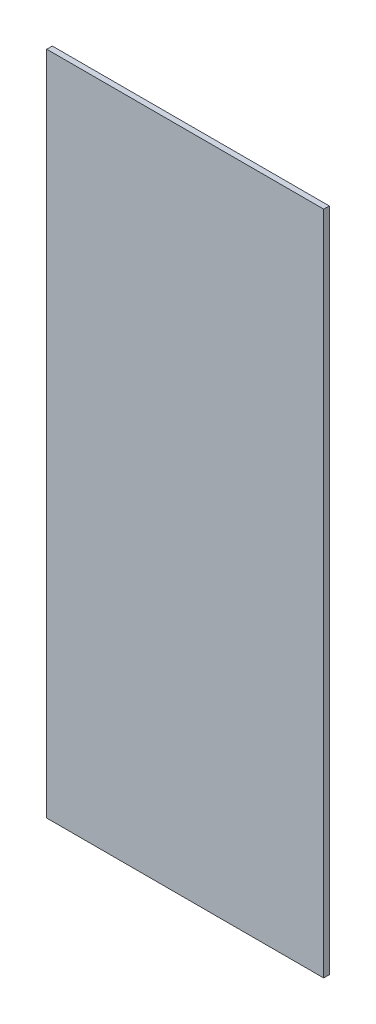
ISO-10303-21;
HEADER;
FILE_DESCRIPTION(('STEP AP214'),'2;1');
FILE_NAME('part.step','',(''),(''),'','','');
FILE_SCHEMA(('AUTOMOTIVE_DESIGN { 1 0 10303 214 1 1 1 1 }'));
ENDSEC;
DATA;
#1=APPLICATION_CONTEXT('core data for automotive mechanical design processes');
#2=APPLICATION_PROTOCOL_DEFINITION('international standard','automotive_design',2000,#1);
#3=PRODUCT_CONTEXT('',#1,'mechanical');
#4=PRODUCT('Part','Part','',(#3));
#5=PRODUCT_RELATED_PRODUCT_CATEGORY('part','',(#4));
#6=PRODUCT_DEFINITION_FORMATION('','',#4);
#7=PRODUCT_DEFINITION_CONTEXT('part definition',#1,'design');
#8=PRODUCT_DEFINITION('design','',#6,#7);
#9=PRODUCT_DEFINITION_SHAPE('','',#8);
#10=(LENGTH_UNIT() NAMED_UNIT(*) SI_UNIT(.MILLI.,.METRE.));
#11=(NAMED_UNIT(*) PLANE_ANGLE_UNIT() SI_UNIT($,.RADIAN.));
#12=(NAMED_UNIT(*) SI_UNIT($,.STERADIAN.) SOLID_ANGLE_UNIT());
#13=UNCERTAINTY_MEASURE_WITH_UNIT(LENGTH_MEASURE(1.E-05),#10,'distance_accuracy_value','');
#14=(GEOMETRIC_REPRESENTATION_CONTEXT(3) GLOBAL_UNCERTAINTY_ASSIGNED_CONTEXT((#13)) GLOBAL_UNIT_ASSIGNED_CONTEXT((#10,
#11,#12)) REPRESENTATION_CONTEXT('',''));
#15=CARTESIAN_POINT('',(0.,0.,0.));
#16=DIRECTION('',(0.,0.,1.));
#17=DIRECTION('',(1.,0.,0.));
#18=AXIS2_PLACEMENT_3D('',#15,#16,#17);
#19=CARTESIAN_POINT('',(-75.4475524607744,204.196458107681,1.5875));
#20=DIRECTION('',(-1.,0.,0.));
#21=DIRECTION('',(0.,-1.,0.));
#22=AXIS2_PLACEMENT_3D('',#19,#20,#21);
#23=PLANE('',#22);
#24=DIRECTION('',(0.,1.,0.));
#25=VECTOR('',#24,1.);
#26=CARTESIAN_POINT('',(-75.4475524607744,204.196458107681,0.));
#27=LINE('',#26,#25);
#28=CARTESIAN_POINT('',(-75.4475524607744,14.5404581076836,0.));
#29=VERTEX_POINT('',#28);
#30=CARTESIAN_POINT('',(-75.4475524607744,204.196458107681,0.));
#31=VERTEX_POINT('',#30);
#32=EDGE_CURVE('E99',#29,#31,#27,.T.);
#33=ORIENTED_EDGE('',*,*,#32,.T.);
#34=DIRECTION('',(0.,0.,-1.));
#35=VECTOR('',#34,1.);
#36=CARTESIAN_POINT('',(-75.4475524607744,204.196458107681,1.5875));
#37=LINE('',#36,#35);
#38=CARTESIAN_POINT('',(-75.4475524607744,204.196458107681,1.5875));
#39=VERTEX_POINT('',#38);
#40=EDGE_CURVE('E11',#39,#31,#37,.T.);
#41=ORIENTED_EDGE('',*,*,#40,.F.);
#42=DIRECTION('',(0.,1.,0.));
#43=VECTOR('',#42,1.);
#44=CARTESIAN_POINT('',(-75.4475524607744,204.196458107681,1.5875));
#45=LINE('',#44,#43);
#46=CARTESIAN_POINT('',(-75.4475524607744,14.5404581076836,1.5875));
#47=VERTEX_POINT('',#46);
#48=EDGE_CURVE('E87',#47,#39,#45,.T.);
#49=ORIENTED_EDGE('',*,*,#48,.F.);
#50=DIRECTION('',(0.,0.,-1.));
#51=VECTOR('',#50,1.);
#52=CARTESIAN_POINT('',(-75.4475524607744,14.5404581076836,1.5875));
#53=LINE('',#52,#51);
#54=EDGE_CURVE('E95',#47,#29,#53,.T.);
#55=ORIENTED_EDGE('',*,*,#54,.T.);
#56=EDGE_LOOP('',(#33,#41,#49,#55));
#57=FACE_BOUND('',#56,.T.);
#58=ADVANCED_FACE('F36',(#57),#23,.F.);
#59=CARTESIAN_POINT('',(-75.4475524607744,204.196458107681,1.5875));
#60=DIRECTION('',(0.,-1.,0.));
#61=DIRECTION('',(0.,0.,-1.));
#62=AXIS2_PLACEMENT_3D('',#59,#60,#61);
#63=PLANE('',#62);
#64=DIRECTION('',(-1.,0.,0.));
#65=VECTOR('',#64,1.);
#66=CARTESIAN_POINT('',(-75.4475524607744,204.196458107681,0.));
#67=LINE('',#66,#65);
#68=CARTESIAN_POINT('',(-154.335052546774,204.196458107681,0.));
#69=VERTEX_POINT('',#68);
#70=EDGE_CURVE('E91',#31,#69,#67,.T.);
#71=ORIENTED_EDGE('',*,*,#70,.T.);
#72=DIRECTION('',(0.,0.,-1.));
#73=VECTOR('',#72,1.);
#74=CARTESIAN_POINT('',(-154.335052546774,204.196458107681,1.5875));
#75=LINE('',#74,#73);
#76=CARTESIAN_POINT('',(-154.335052546774,204.196458107681,1.5875));
#77=VERTEX_POINT('',#76);
#78=EDGE_CURVE('E44',#77,#69,#75,.T.);
#79=ORIENTED_EDGE('',*,*,#78,.F.);
#80=DIRECTION('',(-1.,0.,0.));
#81=VECTOR('',#80,1.);
#82=CARTESIAN_POINT('',(-75.4475524607744,204.196458107681,1.5875));
#83=LINE('',#82,#81);
#84=EDGE_CURVE('E82',#39,#77,#83,.T.);
#85=ORIENTED_EDGE('',*,*,#84,.F.);
#86=ORIENTED_EDGE('',*,*,#40,.T.);
#87=EDGE_LOOP('',(#71,#79,#85,#86));
#88=FACE_BOUND('',#87,.T.);
#89=ADVANCED_FACE('F90',(#88),#63,.F.);
#90=CARTESIAN_POINT('',(-154.335052546774,204.196458107681,1.5875));
#91=DIRECTION('',(1.,0.,0.));
#92=DIRECTION('',(0.,0.,-1.));
#93=AXIS2_PLACEMENT_3D('',#90,#91,#92);
#94=PLANE('',#93);
#95=DIRECTION('',(0.,-1.,0.));
#96=VECTOR('',#95,1.);
#97=CARTESIAN_POINT('',(-154.335052546774,204.196458107681,0.));
#98=LINE('',#97,#96);
#99=CARTESIAN_POINT('',(-154.335052546774,14.5404581076836,0.));
#100=VERTEX_POINT('',#99);
#101=EDGE_CURVE('E69',#69,#100,#98,.T.);
#102=ORIENTED_EDGE('',*,*,#101,.T.);
#103=DIRECTION('',(0.,0.,-1.));
#104=VECTOR('',#103,1.);
#105=CARTESIAN_POINT('',(-154.335052546774,14.5404581076836,1.5875));
#106=LINE('',#105,#104);
#107=CARTESIAN_POINT('',(-154.335052546774,14.5404581076836,1.5875));
#108=VERTEX_POINT('',#107);
#109=EDGE_CURVE('E92',#108,#100,#106,.T.);
#110=ORIENTED_EDGE('',*,*,#109,.F.);
#111=DIRECTION('',(0.,-1.,0.));
#112=VECTOR('',#111,1.);
#113=CARTESIAN_POINT('',(-154.335052546774,204.196458107681,1.5875));
#114=LINE('',#113,#112);
#115=EDGE_CURVE('E85',#77,#108,#114,.T.);
#116=ORIENTED_EDGE('',*,*,#115,.F.);
#117=ORIENTED_EDGE('',*,*,#78,.T.);
#118=EDGE_LOOP('',(#102,#110,#116,#117));
#119=FACE_BOUND('',#118,.T.);
#120=ADVANCED_FACE('F93',(#119),#94,.F.);
#121=CARTESIAN_POINT('',(-75.4475524607744,14.5404581076836,1.5875));
#122=DIRECTION('',(0.,1.,0.));
#123=DIRECTION('',(-1.,0.,0.));
#124=AXIS2_PLACEMENT_3D('',#121,#122,#123);
#125=PLANE('',#124);
#126=DIRECTION('',(1.,0.,0.));
#127=VECTOR('',#126,1.);
#128=CARTESIAN_POINT('',(-75.4475524607744,14.5404581076836,0.));
#129=LINE('',#128,#127);
#130=EDGE_CURVE('E75',#100,#29,#129,.T.);
#131=ORIENTED_EDGE('',*,*,#130,.T.);
#132=ORIENTED_EDGE('',*,*,#54,.F.);
#133=DIRECTION('',(1.,0.,0.));
#134=VECTOR('',#133,1.);
#135=CARTESIAN_POINT('',(-75.4475524607744,14.5404581076836,1.5875));
#136=LINE('',#135,#134);
#137=EDGE_CURVE('E52',#108,#47,#136,.T.);
#138=ORIENTED_EDGE('',*,*,#137,.F.);
#139=ORIENTED_EDGE('',*,*,#109,.T.);
#140=EDGE_LOOP('',(#131,#132,#138,#139));
#141=FACE_BOUND('',#140,.T.);
#142=ADVANCED_FACE('F106',(#141),#125,.F.);
#143=CARTESIAN_POINT('',(0.,0.,1.5875));
#144=DIRECTION('',(0.,0.,-1.));
#145=DIRECTION('',(-1.,0.,0.));
#146=AXIS2_PLACEMENT_3D('',#143,#144,#145);
#147=PLANE('',#146);
#148=ORIENTED_EDGE('',*,*,#48,.T.);
#149=ORIENTED_EDGE('',*,*,#84,.T.);
#150=ORIENTED_EDGE('',*,*,#115,.T.);
#151=ORIENTED_EDGE('',*,*,#137,.T.);
#152=EDGE_LOOP('',(#148,#149,#150,#151));
#153=FACE_BOUND('',#152,.T.);
#154=ADVANCED_FACE('F83',(#153),#147,.F.);
#155=CARTESIAN_POINT('',(0.,0.,0.));
#156=DIRECTION('',(0.,0.,-1.));
#157=DIRECTION('',(-1.,0.,0.));
#158=AXIS2_PLACEMENT_3D('',#155,#156,#157);
#159=PLANE('',#158);
#160=ORIENTED_EDGE('',*,*,#32,.F.);
#161=ORIENTED_EDGE('',*,*,#130,.F.);
#162=ORIENTED_EDGE('',*,*,#101,.F.);
#163=ORIENTED_EDGE('',*,*,#70,.F.);
#164=EDGE_LOOP('',(#160,#161,#162,#163));
#165=FACE_BOUND('',#164,.T.);
#166=ADVANCED_FACE('F109',(#165),#159,.T.);
#167=CLOSED_SHELL('',(#58,#89,#120,#142,#154,#166));
#168=MANIFOLD_SOLID_BREP('B2',#167);
#169=ADVANCED_BREP_SHAPE_REPRESENTATION('',(#18,#168),#14);
#170=SHAPE_DEFINITION_REPRESENTATION(#9,#169);
ENDSEC;
END-ISO-10303-21;
